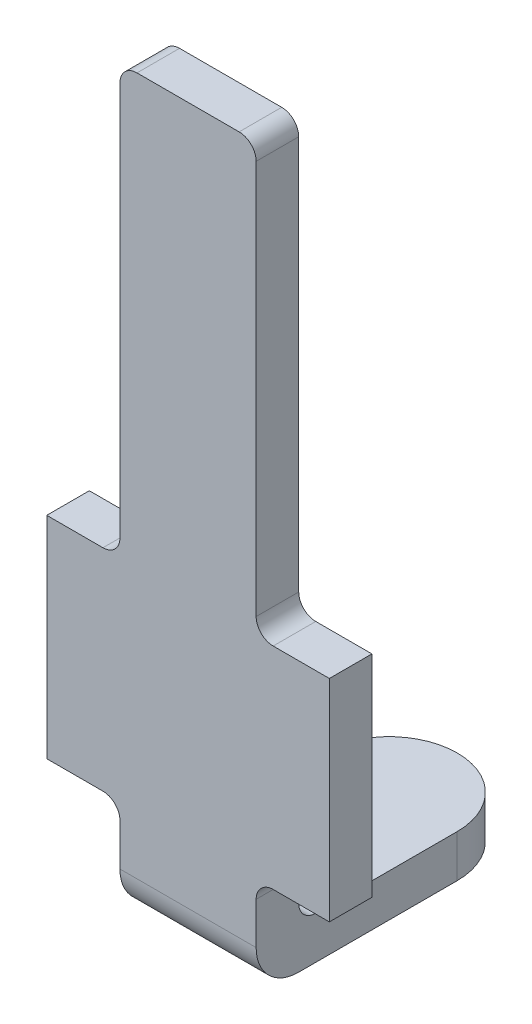
ISO-10303-21;
HEADER;
FILE_DESCRIPTION(('STEP AP214'),'2;1');
FILE_NAME('part.step','',(''),(''),'','','');
FILE_SCHEMA(('AUTOMOTIVE_DESIGN { 1 0 10303 214 1 1 1 1 }'));
ENDSEC;
DATA;
#1=APPLICATION_CONTEXT('core data for automotive mechanical design processes');
#2=APPLICATION_PROTOCOL_DEFINITION('international standard','automotive_design',2000,#1);
#3=PRODUCT_CONTEXT('',#1,'mechanical');
#4=PRODUCT('Part','Part','',(#3));
#5=PRODUCT_RELATED_PRODUCT_CATEGORY('part','',(#4));
#6=PRODUCT_DEFINITION_FORMATION('','',#4);
#7=PRODUCT_DEFINITION_CONTEXT('part definition',#1,'design');
#8=PRODUCT_DEFINITION('design','',#6,#7);
#9=PRODUCT_DEFINITION_SHAPE('','',#8);
#10=(LENGTH_UNIT() NAMED_UNIT(*) SI_UNIT(.MILLI.,.METRE.));
#11=(NAMED_UNIT(*) PLANE_ANGLE_UNIT() SI_UNIT($,.RADIAN.));
#12=(NAMED_UNIT(*) SI_UNIT($,.STERADIAN.) SOLID_ANGLE_UNIT());
#13=UNCERTAINTY_MEASURE_WITH_UNIT(LENGTH_MEASURE(1.E-05),#10,'distance_accuracy_value','');
#14=(GEOMETRIC_REPRESENTATION_CONTEXT(3) GLOBAL_UNCERTAINTY_ASSIGNED_CONTEXT((#13)) GLOBAL_UNIT_ASSIGNED_CONTEXT((#10,
#11,#12)) REPRESENTATION_CONTEXT('',''));
#15=CARTESIAN_POINT('',(0.,0.,0.));
#16=DIRECTION('',(0.,0.,1.));
#17=DIRECTION('',(1.,0.,0.));
#18=AXIS2_PLACEMENT_3D('',#15,#16,#17);
#19=CARTESIAN_POINT('',(-16.91,-0.45,-1.67999999999998));
#20=DIRECTION('',(-1.,0.,0.));
#21=DIRECTION('',(0.,0.,1.));
#22=AXIS2_PLACEMENT_3D('',#19,#20,#21);
#23=PLANE('',#22);
#24=DIRECTION('',(0.,0.,1.));
#25=VECTOR('',#24,1.);
#26=CARTESIAN_POINT('',(-16.91,-0.45,-1.67999999999998));
#27=LINE('',#26,#25);
#28=CARTESIAN_POINT('',(-16.91,-0.45,-1.67999999999998));
#29=VERTEX_POINT('',#28);
#30=CARTESIAN_POINT('',(-16.91,-0.45,-0.74899999999997));
#31=VERTEX_POINT('',#30);
#32=EDGE_CURVE('E278',#29,#31,#27,.T.);
#33=ORIENTED_EDGE('',*,*,#32,.T.);
#34=CARTESIAN_POINT('',(-16.91,-0.2,-0.74899999999997));
#35=DIRECTION('',(-1.,0.,0.));
#36=DIRECTION('',(0.,0.,1.));
#37=AXIS2_PLACEMENT_3D('',#34,#35,#36);
#38=CIRCLE('',#37,0.25);
#39=CARTESIAN_POINT('',(-16.91,-0.2,-0.49899999999997));
#40=VERTEX_POINT('',#39);
#41=EDGE_CURVE('E11',#31,#40,#38,.T.);
#42=ORIENTED_EDGE('',*,*,#41,.T.);
#43=DIRECTION('',(0.,1.,0.));
#44=VECTOR('',#43,1.);
#45=CARTESIAN_POINT('',(-16.91,-0.45,-0.49899999999997));
#46=LINE('',#45,#44);
#47=CARTESIAN_POINT('',(-16.91,0.0459658151929142,-0.49899999999997));
#48=VERTEX_POINT('',#47);
#49=EDGE_CURVE('E288',#40,#48,#46,.T.);
#50=ORIENTED_EDGE('',*,*,#49,.T.);
#51=DIRECTION('',(0.,0.,1.));
#52=VECTOR('',#51,1.);
#53=CARTESIAN_POINT('',(-16.91,0.0459658151929142,-1.67999999999998));
#54=LINE('',#53,#52);
#55=CARTESIAN_POINT('',(-16.91,0.0459658151929143,-0.748999999999971));
#56=VERTEX_POINT('',#55);
#57=EDGE_CURVE('E351',#48,#56,#54,.F.);
#58=ORIENTED_EDGE('',*,*,#57,.T.);
#59=DIRECTION('',(0.,-1.,0.));
#60=VECTOR('',#59,1.);
#61=CARTESIAN_POINT('',(-16.91,3.9,-0.748999999999972));
#62=LINE('',#61,#60);
#63=CARTESIAN_POINT('',(-16.91,-0.1,-0.748999999999971));
#64=VERTEX_POINT('',#63);
#65=EDGE_CURVE('E256',#56,#64,#62,.T.);
#66=ORIENTED_EDGE('',*,*,#65,.T.);
#67=CARTESIAN_POINT('',(-16.91,-0.1,-0.848999999999971));
#68=DIRECTION('',(-1.,0.,0.));
#69=DIRECTION('',(0.,0.,1.));
#70=AXIS2_PLACEMENT_3D('',#67,#68,#69);
#71=CIRCLE('',#70,0.1);
#72=CARTESIAN_POINT('',(-16.91,-0.2,-0.848999999999971));
#73=VERTEX_POINT('',#72);
#74=EDGE_CURVE('E368',#64,#73,#71,.F.);
#75=ORIENTED_EDGE('',*,*,#74,.T.);
#76=DIRECTION('',(0.,0.,-1.));
#77=VECTOR('',#76,1.);
#78=CARTESIAN_POINT('',(-16.91,-0.2,-0.748999999999971));
#79=LINE('',#78,#77);
#80=CARTESIAN_POINT('',(-16.91,-0.2,-1.68));
#81=VERTEX_POINT('',#80);
#82=EDGE_CURVE('E260',#73,#81,#79,.T.);
#83=ORIENTED_EDGE('',*,*,#82,.T.);
#84=DIRECTION('',(0.,1.,0.));
#85=VECTOR('',#84,1.);
#86=CARTESIAN_POINT('',(-16.91,-0.45,-1.67999999999998));
#87=LINE('',#86,#85);
#88=EDGE_CURVE('E291',#29,#81,#87,.T.);
#89=ORIENTED_EDGE('',*,*,#88,.F.);
#90=EDGE_LOOP('',(#33,#42,#50,#58,#66,#75,#83,#89));
#91=FACE_BOUND('',#90,.T.);
#92=ADVANCED_FACE('F42',(#91),#23,.T.);
#93=CARTESIAN_POINT('',(-16.11,-0.45,-0.498999999999972));
#94=DIRECTION('',(1.,0.,0.));
#95=DIRECTION('',(0.,0.,-1.));
#96=AXIS2_PLACEMENT_3D('',#93,#94,#95);
#97=PLANE('',#96);
#98=DIRECTION('',(0.,1.,0.));
#99=VECTOR('',#98,1.);
#100=CARTESIAN_POINT('',(-16.11,-0.45,-0.498999999999972));
#101=LINE('',#100,#99);
#102=CARTESIAN_POINT('',(-16.11,-0.2,-0.498999999999972));
#103=VERTEX_POINT('',#102);
#104=CARTESIAN_POINT('',(-16.11,0.0459658151929142,-0.498999999999972));
#105=VERTEX_POINT('',#104);
#106=EDGE_CURVE('E300',#103,#105,#101,.T.);
#107=ORIENTED_EDGE('',*,*,#106,.F.);
#108=CARTESIAN_POINT('',(-16.11,-0.2,-0.748999999999972));
#109=DIRECTION('',(1.,0.,0.));
#110=DIRECTION('',(0.,0.,-1.));
#111=AXIS2_PLACEMENT_3D('',#108,#109,#110);
#112=CIRCLE('',#111,0.25);
#113=CARTESIAN_POINT('',(-16.11,-0.45,-0.748999999999972));
#114=VERTEX_POINT('',#113);
#115=EDGE_CURVE('E65',#103,#114,#112,.T.);
#116=ORIENTED_EDGE('',*,*,#115,.T.);
#117=DIRECTION('',(0.,0.,-1.));
#118=VECTOR('',#117,1.);
#119=CARTESIAN_POINT('',(-16.11,-0.45,-0.498999999999972));
#120=LINE('',#119,#118);
#121=CARTESIAN_POINT('',(-16.11,-0.45,-1.68));
#122=VERTEX_POINT('',#121);
#123=EDGE_CURVE('E281',#114,#122,#120,.T.);
#124=ORIENTED_EDGE('',*,*,#123,.T.);
#125=DIRECTION('',(0.,1.,0.));
#126=VECTOR('',#125,1.);
#127=CARTESIAN_POINT('',(-16.11,-0.45,-1.68));
#128=LINE('',#127,#126);
#129=CARTESIAN_POINT('',(-16.11,-0.2,-1.68));
#130=VERTEX_POINT('',#129);
#131=EDGE_CURVE('E296',#122,#130,#128,.T.);
#132=ORIENTED_EDGE('',*,*,#131,.T.);
#133=DIRECTION('',(0.,0.,-1.));
#134=VECTOR('',#133,1.);
#135=CARTESIAN_POINT('',(-16.11,-0.2,-0.748999999999971));
#136=LINE('',#135,#134);
#137=CARTESIAN_POINT('',(-16.11,-0.2,-0.848999999999971));
#138=VERTEX_POINT('',#137);
#139=EDGE_CURVE('E261',#138,#130,#136,.T.);
#140=ORIENTED_EDGE('',*,*,#139,.F.);
#141=CARTESIAN_POINT('',(-16.11,-0.1,-0.848999999999971));
#142=DIRECTION('',(1.,0.,0.));
#143=DIRECTION('',(0.,0.,-1.));
#144=AXIS2_PLACEMENT_3D('',#141,#142,#143);
#145=CIRCLE('',#144,0.1);
#146=CARTESIAN_POINT('',(-16.11,-0.1,-0.748999999999971));
#147=VERTEX_POINT('',#146);
#148=EDGE_CURVE('E365',#138,#147,#145,.F.);
#149=ORIENTED_EDGE('',*,*,#148,.T.);
#150=DIRECTION('',(0.,-1.,0.));
#151=VECTOR('',#150,1.);
#152=CARTESIAN_POINT('',(-16.11,3.9,-0.748999999999972));
#153=LINE('',#152,#151);
#154=CARTESIAN_POINT('',(-16.11,0.0459658151929143,-0.748999999999971));
#155=VERTEX_POINT('',#154);
#156=EDGE_CURVE('E255',#155,#147,#153,.T.);
#157=ORIENTED_EDGE('',*,*,#156,.F.);
#158=DIRECTION('',(0.,0.,-1.));
#159=VECTOR('',#158,1.);
#160=CARTESIAN_POINT('',(-16.11,0.0459658151929142,-0.498999999999972));
#161=LINE('',#160,#159);
#162=EDGE_CURVE('E361',#155,#105,#161,.F.);
#163=ORIENTED_EDGE('',*,*,#162,.T.);
#164=EDGE_LOOP('',(#107,#116,#124,#132,#140,#149,#157,#163));
#165=FACE_BOUND('',#164,.T.);
#166=ADVANCED_FACE('F455',(#165),#97,.T.);
#167=CARTESIAN_POINT('',(-16.51,-0.45,-1.68));
#168=DIRECTION('',(0.,1.,0.));
#169=DIRECTION('',(0.,0.,1.));
#170=AXIS2_PLACEMENT_3D('',#167,#168,#169);
#171=CYLINDRICAL_SURFACE('',#170,0.400000000000001);
#172=CARTESIAN_POINT('',(-16.51,-0.2,-1.68));
#173=DIRECTION('',(0.,-1.,0.));
#174=DIRECTION('',(0.,0.,-1.));
#175=AXIS2_PLACEMENT_3D('',#172,#173,#174);
#176=CIRCLE('',#175,0.400000000000001);
#177=EDGE_CURVE('E273',#130,#81,#176,.F.);
#178=ORIENTED_EDGE('',*,*,#177,.F.);
#179=ORIENTED_EDGE('',*,*,#131,.F.);
#180=CARTESIAN_POINT('',(-16.51,-0.45,-1.68));
#181=DIRECTION('',(0.,1.,0.));
#182=DIRECTION('',(0.,0.,1.));
#183=AXIS2_PLACEMENT_3D('',#180,#181,#182);
#184=CIRCLE('',#183,0.400000000000001);
#185=EDGE_CURVE('E284',#122,#29,#184,.T.);
#186=ORIENTED_EDGE('',*,*,#185,.T.);
#187=ORIENTED_EDGE('',*,*,#88,.T.);
#188=EDGE_LOOP('',(#178,#179,#186,#187));
#189=FACE_BOUND('',#188,.T.);
#190=ADVANCED_FACE('F450',(#189),#171,.T.);
#191=CARTESIAN_POINT('',(-16.91,-0.45,-0.49899999999997));
#192=DIRECTION('',(0.,0.,1.));
#193=DIRECTION('',(1.,0.,0.));
#194=AXIS2_PLACEMENT_3D('',#191,#192,#193);
#195=PLANE('',#194);
#196=ORIENTED_EDGE('',*,*,#49,.F.);
#197=DIRECTION('',(1.,0.,0.));
#198=VECTOR('',#197,1.);
#199=CARTESIAN_POINT('',(-16.11,-0.2,-0.498999999999972));
#200=LINE('',#199,#198);
#201=EDGE_CURVE('E395',#40,#103,#200,.T.);
#202=ORIENTED_EDGE('',*,*,#201,.T.);
#203=ORIENTED_EDGE('',*,*,#106,.T.);
#204=CARTESIAN_POINT('',(-16.01,0.0459658151929142,-0.498999999999972));
#205=DIRECTION('',(0.,0.,1.));
#206=DIRECTION('',(1.,0.,0.));
#207=AXIS2_PLACEMENT_3D('',#204,#205,#206);
#208=CIRCLE('',#207,0.1);
#209=CARTESIAN_POINT('',(-16.01,0.145965815192914,-0.498999999999972));
#210=VERTEX_POINT('',#209);
#211=EDGE_CURVE('E392',#105,#210,#208,.F.);
#212=ORIENTED_EDGE('',*,*,#211,.T.);
#213=DIRECTION('',(-1.,0.,0.));
#214=VECTOR('',#213,1.);
#215=CARTESIAN_POINT('',(-15.68,0.145965815192914,-0.498999999999972));
#216=LINE('',#215,#214);
#217=CARTESIAN_POINT('',(-15.68,0.145965815192914,-0.498999999999972));
#218=VERTEX_POINT('',#217);
#219=EDGE_CURVE('E251',#218,#210,#216,.T.);
#220=ORIENTED_EDGE('',*,*,#219,.F.);
#221=DIRECTION('',(0.,-1.,0.));
#222=VECTOR('',#221,1.);
#223=CARTESIAN_POINT('',(-15.68,0.145965815192914,-0.498999999999972));
#224=LINE('',#223,#222);
#225=CARTESIAN_POINT('',(-15.68,1.38437551370885,-0.498999999999972));
#226=VERTEX_POINT('',#225);
#227=EDGE_CURVE('E237',#226,#218,#224,.T.);
#228=ORIENTED_EDGE('',*,*,#227,.F.);
#229=DIRECTION('',(-1.,0.,0.));
#230=VECTOR('',#229,1.);
#231=CARTESIAN_POINT('',(-15.68,1.38437551370885,-0.498999999999968));
#232=LINE('',#231,#230);
#233=CARTESIAN_POINT('',(-16.01,1.38437551370885,-0.498999999999968));
#234=VERTEX_POINT('',#233);
#235=EDGE_CURVE('E407',#226,#234,#232,.T.);
#236=ORIENTED_EDGE('',*,*,#235,.T.);
#237=CARTESIAN_POINT('',(-16.01,1.48437551370885,-0.498999999999972));
#238=DIRECTION('',(0.,0.,1.));
#239=DIRECTION('',(1.,0.,0.));
#240=AXIS2_PLACEMENT_3D('',#237,#238,#239);
#241=CIRCLE('',#240,0.1);
#242=CARTESIAN_POINT('',(-16.11,1.48437551370885,-0.498999999999968));
#243=VERTEX_POINT('',#242);
#244=EDGE_CURVE('E374',#234,#243,#241,.F.);
#245=ORIENTED_EDGE('',*,*,#244,.T.);
#246=DIRECTION('',(0.,1.,0.));
#247=VECTOR('',#246,1.);
#248=CARTESIAN_POINT('',(-16.11,1.38437551370885,-0.498999999999968));
#249=LINE('',#248,#247);
#250=CARTESIAN_POINT('',(-16.11,3.8,-0.498999999999969));
#251=VERTEX_POINT('',#250);
#252=EDGE_CURVE('E414',#243,#251,#249,.T.);
#253=ORIENTED_EDGE('',*,*,#252,.T.);
#254=CARTESIAN_POINT('',(-16.21,3.8,-0.498999999999971));
#255=DIRECTION('',(0.,0.,1.));
#256=DIRECTION('',(1.,0.,0.));
#257=AXIS2_PLACEMENT_3D('',#254,#255,#256);
#258=CIRCLE('',#257,0.1);
#259=CARTESIAN_POINT('',(-16.21,3.9,-0.498999999999971));
#260=VERTEX_POINT('',#259);
#261=EDGE_CURVE('E327',#251,#260,#258,.T.);
#262=ORIENTED_EDGE('',*,*,#261,.T.);
#263=DIRECTION('',(1.,0.,0.));
#264=VECTOR('',#263,1.);
#265=CARTESIAN_POINT('',(-16.91,3.9,-0.49899999999997));
#266=LINE('',#265,#264);
#267=CARTESIAN_POINT('',(-16.81,3.9,-0.49899999999997));
#268=VERTEX_POINT('',#267);
#269=EDGE_CURVE('E277',#268,#260,#266,.T.);
#270=ORIENTED_EDGE('',*,*,#269,.F.);
#271=CARTESIAN_POINT('',(-16.81,3.8,-0.49899999999997));
#272=DIRECTION('',(0.,0.,1.));
#273=DIRECTION('',(1.,0.,0.));
#274=AXIS2_PLACEMENT_3D('',#271,#272,#273);
#275=CIRCLE('',#274,0.1);
#276=CARTESIAN_POINT('',(-16.91,3.8,-0.498999999999968));
#277=VERTEX_POINT('',#276);
#278=EDGE_CURVE('E330',#268,#277,#275,.T.);
#279=ORIENTED_EDGE('',*,*,#278,.T.);
#280=DIRECTION('',(0.,-1.,0.));
#281=VECTOR('',#280,1.);
#282=CARTESIAN_POINT('',(-16.91,3.9,-0.498999999999968));
#283=LINE('',#282,#281);
#284=CARTESIAN_POINT('',(-16.91,1.48437551370885,-0.498999999999967));
#285=VERTEX_POINT('',#284);
#286=EDGE_CURVE('E206',#277,#285,#283,.T.);
#287=ORIENTED_EDGE('',*,*,#286,.T.);
#288=CARTESIAN_POINT('',(-17.01,1.48437551370885,-0.49899999999997));
#289=DIRECTION('',(0.,0.,1.));
#290=DIRECTION('',(1.,0.,0.));
#291=AXIS2_PLACEMENT_3D('',#288,#289,#290);
#292=CIRCLE('',#291,0.1);
#293=CARTESIAN_POINT('',(-17.01,1.38437551370885,-0.498999999999967));
#294=VERTEX_POINT('',#293);
#295=EDGE_CURVE('E200',#285,#294,#292,.F.);
#296=ORIENTED_EDGE('',*,*,#295,.T.);
#297=DIRECTION('',(-1.,0.,0.));
#298=VECTOR('',#297,1.);
#299=CARTESIAN_POINT('',(-16.91,1.38437551370885,-0.498999999999967));
#300=LINE('',#299,#298);
#301=CARTESIAN_POINT('',(-17.34,1.38437551370885,-0.498999999999967));
#302=VERTEX_POINT('',#301);
#303=EDGE_CURVE('E191',#294,#302,#300,.T.);
#304=ORIENTED_EDGE('',*,*,#303,.T.);
#305=DIRECTION('',(0.,1.,0.));
#306=VECTOR('',#305,1.);
#307=CARTESIAN_POINT('',(-17.34,3.9,-0.498999999999969));
#308=LINE('',#307,#306);
#309=CARTESIAN_POINT('',(-17.34,0.145965815192914,-0.498999999999969));
#310=VERTEX_POINT('',#309);
#311=EDGE_CURVE('E197',#310,#302,#308,.T.);
#312=ORIENTED_EDGE('',*,*,#311,.F.);
#313=DIRECTION('',(1.,0.,0.));
#314=VECTOR('',#313,1.);
#315=CARTESIAN_POINT('',(-17.34,0.145965815192914,-0.498999999999969));
#316=LINE('',#315,#314);
#317=CARTESIAN_POINT('',(-17.01,0.145965815192914,-0.498999999999969));
#318=VERTEX_POINT('',#317);
#319=EDGE_CURVE('E222',#310,#318,#316,.T.);
#320=ORIENTED_EDGE('',*,*,#319,.T.);
#321=CARTESIAN_POINT('',(-17.01,0.0459658151929142,-0.49899999999997));
#322=DIRECTION('',(0.,0.,1.));
#323=DIRECTION('',(1.,0.,0.));
#324=AXIS2_PLACEMENT_3D('',#321,#322,#323);
#325=CIRCLE('',#324,0.1);
#326=EDGE_CURVE('E377',#318,#48,#325,.F.);
#327=ORIENTED_EDGE('',*,*,#326,.T.);
#328=EDGE_LOOP('',(#196,#202,#203,#212,#220,#228,#236,#245,#253,#262,#270,#279,#287,#296,#304,
#312,#320,#327));
#329=FACE_BOUND('',#328,.T.);
#330=ADVANCED_FACE('F194',(#329),#195,.T.);
#331=CARTESIAN_POINT('',(-16.51,-0.45,-1.68));
#332=DIRECTION('',(0.,1.,0.));
#333=DIRECTION('',(0.,0.,1.));
#334=AXIS2_PLACEMENT_3D('',#331,#332,#333);
#335=PLANE('',#334);
#336=ORIENTED_EDGE('',*,*,#123,.F.);
#337=DIRECTION('',(1.,0.,0.));
#338=VECTOR('',#337,1.);
#339=CARTESIAN_POINT('',(-16.91,-0.45,-0.74899999999997));
#340=LINE('',#339,#338);
#341=EDGE_CURVE('E51',#114,#31,#340,.F.);
#342=ORIENTED_EDGE('',*,*,#341,.T.);
#343=ORIENTED_EDGE('',*,*,#32,.F.);
#344=ORIENTED_EDGE('',*,*,#185,.F.);
#345=EDGE_LOOP('',(#336,#342,#343,#344));
#346=FACE_BOUND('',#345,.T.);
#347=ADVANCED_FACE('F453',(#346),#335,.F.);
#348=CARTESIAN_POINT('',(-16.51,3.9,-1.68));
#349=DIRECTION('',(0.,1.,0.));
#350=DIRECTION('',(0.,0.,1.));
#351=AXIS2_PLACEMENT_3D('',#348,#349,#350);
#352=PLANE('',#351);
#353=DIRECTION('',(1.,0.,0.));
#354=VECTOR('',#353,1.);
#355=CARTESIAN_POINT('',(-16.91,3.9,-0.748999999999972));
#356=LINE('',#355,#354);
#357=CARTESIAN_POINT('',(-16.81,3.9,-0.748999999999972));
#358=VERTEX_POINT('',#357);
#359=CARTESIAN_POINT('',(-16.21,3.9,-0.748999999999972));
#360=VERTEX_POINT('',#359);
#361=EDGE_CURVE('E264',#358,#360,#356,.T.);
#362=ORIENTED_EDGE('',*,*,#361,.F.);
#363=DIRECTION('',(0.,0.,-1.));
#364=VECTOR('',#363,1.);
#365=CARTESIAN_POINT('',(-16.81,3.9,-0.498999999999968));
#366=LINE('',#365,#364);
#367=EDGE_CURVE('E324',#358,#268,#366,.F.);
#368=ORIENTED_EDGE('',*,*,#367,.T.);
#369=ORIENTED_EDGE('',*,*,#269,.T.);
#370=DIRECTION('',(0.,0.,-1.));
#371=VECTOR('',#370,1.);
#372=CARTESIAN_POINT('',(-16.21,3.9,-0.748999999999972));
#373=LINE('',#372,#371);
#374=EDGE_CURVE('E320',#260,#360,#373,.T.);
#375=ORIENTED_EDGE('',*,*,#374,.T.);
#376=EDGE_LOOP('',(#362,#368,#369,#375));
#377=FACE_BOUND('',#376,.T.);
#378=ADVANCED_FACE('F487',(#377),#352,.T.);
#379=CARTESIAN_POINT('',(-16.91,-0.2,-0.748999999999971));
#380=DIRECTION('',(0.,-1.,0.));
#381=DIRECTION('',(0.,0.,-1.));
#382=AXIS2_PLACEMENT_3D('',#379,#380,#381);
#383=PLANE('',#382);
#384=ORIENTED_EDGE('',*,*,#82,.F.);
#385=DIRECTION('',(1.,0.,0.));
#386=VECTOR('',#385,1.);
#387=CARTESIAN_POINT('',(-16.11,-0.2,-0.848999999999971));
#388=LINE('',#387,#386);
#389=EDGE_CURVE('E333',#73,#138,#388,.T.);
#390=ORIENTED_EDGE('',*,*,#389,.T.);
#391=ORIENTED_EDGE('',*,*,#139,.T.);
#392=ORIENTED_EDGE('',*,*,#177,.T.);
#393=EDGE_LOOP('',(#384,#390,#391,#392));
#394=FACE_BOUND('',#393,.T.);
#395=ADVANCED_FACE('F445',(#394),#383,.F.);
#396=CARTESIAN_POINT('',(-16.91,3.9,-0.748999999999972));
#397=DIRECTION('',(0.,0.,1.));
#398=DIRECTION('',(0.,-1.,0.));
#399=AXIS2_PLACEMENT_3D('',#396,#397,#398);
#400=PLANE('',#399);
#401=DIRECTION('',(0.,-1.,0.));
#402=VECTOR('',#401,1.);
#403=CARTESIAN_POINT('',(-16.91,3.9,-0.748999999999972));
#404=LINE('',#403,#402);
#405=CARTESIAN_POINT('',(-16.91,3.8,-0.748999999999972));
#406=VERTEX_POINT('',#405);
#407=CARTESIAN_POINT('',(-16.91,1.48437551370885,-0.748999999999971));
#408=VERTEX_POINT('',#407);
#409=EDGE_CURVE('E403',#406,#408,#404,.T.);
#410=ORIENTED_EDGE('',*,*,#409,.F.);
#411=CARTESIAN_POINT('',(-16.81,3.8,-0.748999999999972));
#412=DIRECTION('',(0.,0.,1.));
#413=DIRECTION('',(0.,-1.,0.));
#414=AXIS2_PLACEMENT_3D('',#411,#412,#413);
#415=CIRCLE('',#414,0.1);
#416=EDGE_CURVE('E317',#406,#358,#415,.F.);
#417=ORIENTED_EDGE('',*,*,#416,.T.);
#418=ORIENTED_EDGE('',*,*,#361,.T.);
#419=CARTESIAN_POINT('',(-16.21,3.8,-0.748999999999972));
#420=DIRECTION('',(0.,0.,1.));
#421=DIRECTION('',(0.,-1.,0.));
#422=AXIS2_PLACEMENT_3D('',#419,#420,#421);
#423=CIRCLE('',#422,0.1);
#424=CARTESIAN_POINT('',(-16.11,3.8,-0.748999999999972));
#425=VERTEX_POINT('',#424);
#426=EDGE_CURVE('E311',#360,#425,#423,.F.);
#427=ORIENTED_EDGE('',*,*,#426,.T.);
#428=DIRECTION('',(0.,1.,0.));
#429=VECTOR('',#428,1.);
#430=CARTESIAN_POINT('',(-16.11,1.38437551370885,-0.748999999999971));
#431=LINE('',#430,#429);
#432=CARTESIAN_POINT('',(-16.11,1.48437551370885,-0.748999999999971));
#433=VERTEX_POINT('',#432);
#434=EDGE_CURVE('E405',#433,#425,#431,.T.);
#435=ORIENTED_EDGE('',*,*,#434,.F.);
#436=CARTESIAN_POINT('',(-16.01,1.48437551370885,-0.748999999999971));
#437=DIRECTION('',(0.,0.,1.));
#438=DIRECTION('',(0.,-1.,0.));
#439=AXIS2_PLACEMENT_3D('',#436,#437,#438);
#440=CIRCLE('',#439,0.1);
#441=CARTESIAN_POINT('',(-16.01,1.38437551370885,-0.748999999999971));
#442=VERTEX_POINT('',#441);
#443=EDGE_CURVE('E371',#433,#442,#440,.T.);
#444=ORIENTED_EDGE('',*,*,#443,.T.);
#445=DIRECTION('',(-1.,0.,0.));
#446=VECTOR('',#445,1.);
#447=CARTESIAN_POINT('',(-15.68,1.38437551370885,-0.748999999999971));
#448=LINE('',#447,#446);
#449=CARTESIAN_POINT('',(-15.68,1.38437551370885,-0.748999999999971));
#450=VERTEX_POINT('',#449);
#451=EDGE_CURVE('E215',#450,#442,#448,.T.);
#452=ORIENTED_EDGE('',*,*,#451,.F.);
#453=DIRECTION('',(0.,1.,0.));
#454=VECTOR('',#453,1.);
#455=CARTESIAN_POINT('',(-15.68,3.9,-0.748999999999972));
#456=LINE('',#455,#454);
#457=CARTESIAN_POINT('',(-15.68,0.145965815192914,-0.748999999999972));
#458=VERTEX_POINT('',#457);
#459=EDGE_CURVE('E243',#458,#450,#456,.T.);
#460=ORIENTED_EDGE('',*,*,#459,.F.);
#461=DIRECTION('',(-1.,0.,0.));
#462=VECTOR('',#461,1.);
#463=CARTESIAN_POINT('',(-15.68,0.145965815192914,-0.748999999999972));
#464=LINE('',#463,#462);
#465=CARTESIAN_POINT('',(-16.01,0.145965815192914,-0.748999999999972));
#466=VERTEX_POINT('',#465);
#467=EDGE_CURVE('E247',#458,#466,#464,.T.);
#468=ORIENTED_EDGE('',*,*,#467,.T.);
#469=CARTESIAN_POINT('',(-16.01,0.0459658151929142,-0.748999999999971));
#470=DIRECTION('',(0.,0.,1.));
#471=DIRECTION('',(0.,-1.,0.));
#472=AXIS2_PLACEMENT_3D('',#469,#470,#471);
#473=CIRCLE('',#472,0.1);
#474=EDGE_CURVE('E389',#466,#155,#473,.T.);
#475=ORIENTED_EDGE('',*,*,#474,.T.);
#476=ORIENTED_EDGE('',*,*,#156,.T.);
#477=DIRECTION('',(1.,0.,0.));
#478=VECTOR('',#477,1.);
#479=CARTESIAN_POINT('',(-16.91,-0.1,-0.748999999999971));
#480=LINE('',#479,#478);
#481=EDGE_CURVE('E314',#147,#64,#480,.F.);
#482=ORIENTED_EDGE('',*,*,#481,.T.);
#483=ORIENTED_EDGE('',*,*,#65,.F.);
#484=CARTESIAN_POINT('',(-17.01,0.0459658151929142,-0.748999999999971));
#485=DIRECTION('',(0.,0.,1.));
#486=DIRECTION('',(0.,-1.,0.));
#487=AXIS2_PLACEMENT_3D('',#484,#485,#486);
#488=CIRCLE('',#487,0.1);
#489=CARTESIAN_POINT('',(-17.01,0.145965815192914,-0.748999999999969));
#490=VERTEX_POINT('',#489);
#491=EDGE_CURVE('E381',#56,#490,#488,.T.);
#492=ORIENTED_EDGE('',*,*,#491,.T.);
#493=DIRECTION('',(1.,0.,0.));
#494=VECTOR('',#493,1.);
#495=CARTESIAN_POINT('',(-17.34,0.145965815192914,-0.748999999999969));
#496=LINE('',#495,#494);
#497=CARTESIAN_POINT('',(-17.34,0.145965815192914,-0.748999999999969));
#498=VERTEX_POINT('',#497);
#499=EDGE_CURVE('E227',#498,#490,#496,.T.);
#500=ORIENTED_EDGE('',*,*,#499,.F.);
#501=DIRECTION('',(0.,-1.,0.));
#502=VECTOR('',#501,1.);
#503=CARTESIAN_POINT('',(-17.34,0.145965815192914,-0.748999999999969));
#504=LINE('',#503,#502);
#505=CARTESIAN_POINT('',(-17.34,1.38437551370885,-0.748999999999969));
#506=VERTEX_POINT('',#505);
#507=EDGE_CURVE('E230',#506,#498,#504,.T.);
#508=ORIENTED_EDGE('',*,*,#507,.F.);
#509=DIRECTION('',(-1.,0.,0.));
#510=VECTOR('',#509,1.);
#511=CARTESIAN_POINT('',(-16.91,1.38437551370885,-0.748999999999971));
#512=LINE('',#511,#510);
#513=CARTESIAN_POINT('',(-17.01,1.38437551370885,-0.748999999999971));
#514=VERTEX_POINT('',#513);
#515=EDGE_CURVE('E211',#514,#506,#512,.T.);
#516=ORIENTED_EDGE('',*,*,#515,.F.);
#517=CARTESIAN_POINT('',(-17.01,1.48437551370885,-0.748999999999971));
#518=DIRECTION('',(0.,0.,1.));
#519=DIRECTION('',(0.,-1.,0.));
#520=AXIS2_PLACEMENT_3D('',#517,#518,#519);
#521=CIRCLE('',#520,0.1);
#522=EDGE_CURVE('E384',#514,#408,#521,.T.);
#523=ORIENTED_EDGE('',*,*,#522,.T.);
#524=EDGE_LOOP('',(#410,#417,#418,#427,#435,#444,#452,#460,#468,#475,#476,#482,#483,#492,#500,
#508,#516,#523));
#525=FACE_BOUND('',#524,.T.);
#526=ADVANCED_FACE('F426',(#525),#400,.F.);
#527=CARTESIAN_POINT('',(-15.68,0.145965815192914,-0.748999999999972));
#528=DIRECTION('',(0.,1.,0.));
#529=DIRECTION('',(0.,0.,1.));
#530=AXIS2_PLACEMENT_3D('',#527,#528,#529);
#531=PLANE('',#530);
#532=ORIENTED_EDGE('',*,*,#219,.T.);
#533=DIRECTION('',(0.,0.,-1.));
#534=VECTOR('',#533,1.);
#535=CARTESIAN_POINT('',(-16.01,0.145965815192914,-0.748999999999972));
#536=LINE('',#535,#534);
#537=EDGE_CURVE('E357',#210,#466,#536,.T.);
#538=ORIENTED_EDGE('',*,*,#537,.T.);
#539=ORIENTED_EDGE('',*,*,#467,.F.);
#540=DIRECTION('',(0.,0.,-1.));
#541=VECTOR('',#540,1.);
#542=CARTESIAN_POINT('',(-15.68,0.145965815192914,-0.748999999999972));
#543=LINE('',#542,#541);
#544=EDGE_CURVE('E240',#218,#458,#543,.T.);
#545=ORIENTED_EDGE('',*,*,#544,.F.);
#546=EDGE_LOOP('',(#532,#538,#539,#545));
#547=FACE_BOUND('',#546,.T.);
#548=ADVANCED_FACE('F465',(#547),#531,.F.);
#549=CARTESIAN_POINT('',(-15.68,0.,0.));
#550=DIRECTION('',(-1.,0.,0.));
#551=DIRECTION('',(0.,0.,1.));
#552=AXIS2_PLACEMENT_3D('',#549,#550,#551);
#553=PLANE('',#552);
#554=ORIENTED_EDGE('',*,*,#459,.T.);
#555=DIRECTION('',(0.,0.,-1.));
#556=VECTOR('',#555,1.);
#557=CARTESIAN_POINT('',(-15.68,1.38437551370885,-0.498999999999968));
#558=LINE('',#557,#556);
#559=EDGE_CURVE('E421',#226,#450,#558,.T.);
#560=ORIENTED_EDGE('',*,*,#559,.F.);
#561=ORIENTED_EDGE('',*,*,#227,.T.);
#562=ORIENTED_EDGE('',*,*,#544,.T.);
#563=EDGE_LOOP('',(#554,#560,#561,#562));
#564=FACE_BOUND('',#563,.T.);
#565=ADVANCED_FACE('F469',(#564),#553,.F.);
#566=CARTESIAN_POINT('',(-17.34,0.145965815192914,-0.498999999999969));
#567=DIRECTION('',(0.,1.,0.));
#568=DIRECTION('',(0.,0.,1.));
#569=AXIS2_PLACEMENT_3D('',#566,#567,#568);
#570=PLANE('',#569);
#571=ORIENTED_EDGE('',*,*,#499,.T.);
#572=DIRECTION('',(0.,0.,1.));
#573=VECTOR('',#572,1.);
#574=CARTESIAN_POINT('',(-17.01,0.145965815192914,-0.498999999999969));
#575=LINE('',#574,#573);
#576=EDGE_CURVE('E347',#490,#318,#575,.T.);
#577=ORIENTED_EDGE('',*,*,#576,.T.);
#578=ORIENTED_EDGE('',*,*,#319,.F.);
#579=DIRECTION('',(0.,0.,1.));
#580=VECTOR('',#579,1.);
#581=CARTESIAN_POINT('',(-17.34,0.145965815192914,-0.498999999999969));
#582=LINE('',#581,#580);
#583=EDGE_CURVE('E219',#498,#310,#582,.T.);
#584=ORIENTED_EDGE('',*,*,#583,.F.);
#585=EDGE_LOOP('',(#571,#577,#578,#584));
#586=FACE_BOUND('',#585,.T.);
#587=ADVANCED_FACE('F431',(#586),#570,.F.);
#588=CARTESIAN_POINT('',(-17.34,0.,0.));
#589=DIRECTION('',(1.,0.,0.));
#590=DIRECTION('',(0.,0.,-1.));
#591=AXIS2_PLACEMENT_3D('',#588,#589,#590);
#592=PLANE('',#591);
#593=ORIENTED_EDGE('',*,*,#311,.T.);
#594=DIRECTION('',(0.,0.,-1.));
#595=VECTOR('',#594,1.);
#596=CARTESIAN_POINT('',(-17.34,1.38437551370885,-0.498999999999967));
#597=LINE('',#596,#595);
#598=EDGE_CURVE('E205',#302,#506,#597,.T.);
#599=ORIENTED_EDGE('',*,*,#598,.T.);
#600=ORIENTED_EDGE('',*,*,#507,.T.);
#601=ORIENTED_EDGE('',*,*,#583,.T.);
#602=EDGE_LOOP('',(#593,#599,#600,#601));
#603=FACE_BOUND('',#602,.T.);
#604=ADVANCED_FACE('F217',(#603),#592,.F.);
#605=CARTESIAN_POINT('',(-16.11,1.38437551370885,-0.498999999999968));
#606=DIRECTION('',(-1.,0.,0.));
#607=DIRECTION('',(0.,0.,1.));
#608=AXIS2_PLACEMENT_3D('',#605,#606,#607);
#609=PLANE('',#608);
#610=ORIENTED_EDGE('',*,*,#252,.F.);
#611=DIRECTION('',(0.,0.,-1.));
#612=VECTOR('',#611,1.);
#613=CARTESIAN_POINT('',(-16.11,1.48437551370885,-0.748999999999971));
#614=LINE('',#613,#612);
#615=EDGE_CURVE('E340',#243,#433,#614,.T.);
#616=ORIENTED_EDGE('',*,*,#615,.T.);
#617=ORIENTED_EDGE('',*,*,#434,.T.);
#618=DIRECTION('',(0.,0.,-1.));
#619=VECTOR('',#618,1.);
#620=CARTESIAN_POINT('',(-16.11,3.8,-0.498999999999969));
#621=LINE('',#620,#619);
#622=EDGE_CURVE('E337',#425,#251,#621,.F.);
#623=ORIENTED_EDGE('',*,*,#622,.T.);
#624=EDGE_LOOP('',(#610,#616,#617,#623));
#625=FACE_BOUND('',#624,.T.);
#626=ADVANCED_FACE('F479',(#625),#609,.F.);
#627=CARTESIAN_POINT('',(-15.68,1.38437551370885,-0.498999999999968));
#628=DIRECTION('',(0.,-1.,0.));
#629=DIRECTION('',(0.,0.,-1.));
#630=AXIS2_PLACEMENT_3D('',#627,#628,#629);
#631=PLANE('',#630);
#632=ORIENTED_EDGE('',*,*,#451,.T.);
#633=DIRECTION('',(0.,0.,-1.));
#634=VECTOR('',#633,1.);
#635=CARTESIAN_POINT('',(-16.01,1.38437551370885,-0.498999999999968));
#636=LINE('',#635,#634);
#637=EDGE_CURVE('E344',#442,#234,#636,.F.);
#638=ORIENTED_EDGE('',*,*,#637,.T.);
#639=ORIENTED_EDGE('',*,*,#235,.F.);
#640=ORIENTED_EDGE('',*,*,#559,.T.);
#641=EDGE_LOOP('',(#632,#638,#639,#640));
#642=FACE_BOUND('',#641,.T.);
#643=ADVANCED_FACE('F665',(#642),#631,.F.);
#644=CARTESIAN_POINT('',(-16.91,3.9,-0.498999999999968));
#645=DIRECTION('',(1.,0.,0.));
#646=DIRECTION('',(0.,0.,-1.));
#647=AXIS2_PLACEMENT_3D('',#644,#645,#646);
#648=PLANE('',#647);
#649=ORIENTED_EDGE('',*,*,#286,.F.);
#650=DIRECTION('',(0.,0.,-1.));
#651=VECTOR('',#650,1.);
#652=CARTESIAN_POINT('',(-16.91,3.8,-0.748999999999972));
#653=LINE('',#652,#651);
#654=EDGE_CURVE('E307',#277,#406,#653,.T.);
#655=ORIENTED_EDGE('',*,*,#654,.T.);
#656=ORIENTED_EDGE('',*,*,#409,.T.);
#657=DIRECTION('',(0.,0.,-1.));
#658=VECTOR('',#657,1.);
#659=CARTESIAN_POINT('',(-16.91,1.48437551370885,-0.498999999999967));
#660=LINE('',#659,#658);
#661=EDGE_CURVE('E295',#408,#285,#660,.F.);
#662=ORIENTED_EDGE('',*,*,#661,.T.);
#663=EDGE_LOOP('',(#649,#655,#656,#662));
#664=FACE_BOUND('',#663,.T.);
#665=ADVANCED_FACE('F497',(#664),#648,.F.);
#666=CARTESIAN_POINT('',(-16.91,1.38437551370885,-0.498999999999967));
#667=DIRECTION('',(0.,-1.,0.));
#668=DIRECTION('',(0.,0.,-1.));
#669=AXIS2_PLACEMENT_3D('',#666,#667,#668);
#670=PLANE('',#669);
#671=ORIENTED_EDGE('',*,*,#303,.F.);
#672=DIRECTION('',(0.,0.,-1.));
#673=VECTOR('',#672,1.);
#674=CARTESIAN_POINT('',(-17.01,1.38437551370885,-0.748999999999971));
#675=LINE('',#674,#673);
#676=EDGE_CURVE('E354',#294,#514,#675,.T.);
#677=ORIENTED_EDGE('',*,*,#676,.T.);
#678=ORIENTED_EDGE('',*,*,#515,.T.);
#679=ORIENTED_EDGE('',*,*,#598,.F.);
#680=EDGE_LOOP('',(#671,#677,#678,#679));
#681=FACE_BOUND('',#680,.T.);
#682=ADVANCED_FACE('F209',(#681),#670,.F.);
#683=CARTESIAN_POINT('',(-16.81,3.8,-0.498999999999968));
#684=DIRECTION('',(0.,0.,1.));
#685=DIRECTION('',(1.,0.,0.));
#686=AXIS2_PLACEMENT_3D('',#683,#684,#685);
#687=CYLINDRICAL_SURFACE('',#686,0.1);
#688=ORIENTED_EDGE('',*,*,#278,.F.);
#689=ORIENTED_EDGE('',*,*,#367,.F.);
#690=ORIENTED_EDGE('',*,*,#416,.F.);
#691=ORIENTED_EDGE('',*,*,#654,.F.);
#692=EDGE_LOOP('',(#688,#689,#690,#691));
#693=FACE_BOUND('',#692,.T.);
#694=ADVANCED_FACE('F494',(#693),#687,.T.);
#695=CARTESIAN_POINT('',(-16.91,-0.1,-0.848999999999971));
#696=DIRECTION('',(-1.,0.,0.));
#697=DIRECTION('',(0.,0.,1.));
#698=AXIS2_PLACEMENT_3D('',#695,#696,#697);
#699=CYLINDRICAL_SURFACE('',#698,0.1);
#700=ORIENTED_EDGE('',*,*,#74,.F.);
#701=ORIENTED_EDGE('',*,*,#481,.F.);
#702=ORIENTED_EDGE('',*,*,#148,.F.);
#703=ORIENTED_EDGE('',*,*,#389,.F.);
#704=EDGE_LOOP('',(#700,#701,#702,#703));
#705=FACE_BOUND('',#704,.T.);
#706=ADVANCED_FACE('F441',(#705),#699,.F.);
#707=CARTESIAN_POINT('',(-16.01,1.48437551370885,-0.498999999999968));
#708=DIRECTION('',(0.,0.,1.));
#709=DIRECTION('',(0.,-1.,0.));
#710=AXIS2_PLACEMENT_3D('',#707,#708,#709);
#711=CYLINDRICAL_SURFACE('',#710,0.1);
#712=ORIENTED_EDGE('',*,*,#244,.F.);
#713=ORIENTED_EDGE('',*,*,#637,.F.);
#714=ORIENTED_EDGE('',*,*,#443,.F.);
#715=ORIENTED_EDGE('',*,*,#615,.F.);
#716=EDGE_LOOP('',(#712,#713,#714,#715));
#717=FACE_BOUND('',#716,.T.);
#718=ADVANCED_FACE('F478',(#717),#711,.F.);
#719=CARTESIAN_POINT('',(-16.21,3.8,-1.68));
#720=DIRECTION('',(0.,0.,1.));
#721=DIRECTION('',(1.,0.,0.));
#722=AXIS2_PLACEMENT_3D('',#719,#720,#721);
#723=CYLINDRICAL_SURFACE('',#722,0.1);
#724=ORIENTED_EDGE('',*,*,#261,.F.);
#725=ORIENTED_EDGE('',*,*,#622,.F.);
#726=ORIENTED_EDGE('',*,*,#426,.F.);
#727=ORIENTED_EDGE('',*,*,#374,.F.);
#728=EDGE_LOOP('',(#724,#725,#726,#727));
#729=FACE_BOUND('',#728,.T.);
#730=ADVANCED_FACE('F485',(#729),#723,.T.);
#731=CARTESIAN_POINT('',(-17.01,0.0459658151929142,-0.498999999999969));
#732=DIRECTION('',(0.,0.,1.));
#733=DIRECTION('',(1.,0.,0.));
#734=AXIS2_PLACEMENT_3D('',#731,#732,#733);
#735=CYLINDRICAL_SURFACE('',#734,0.1);
#736=ORIENTED_EDGE('',*,*,#491,.F.);
#737=ORIENTED_EDGE('',*,*,#57,.F.);
#738=ORIENTED_EDGE('',*,*,#326,.F.);
#739=ORIENTED_EDGE('',*,*,#576,.F.);
#740=EDGE_LOOP('',(#736,#737,#738,#739));
#741=FACE_BOUND('',#740,.T.);
#742=ADVANCED_FACE('F435',(#741),#735,.F.);
#743=CARTESIAN_POINT('',(-17.01,1.48437551370885,-0.498999999999967));
#744=DIRECTION('',(0.,0.,1.));
#745=DIRECTION('',(0.,-1.,0.));
#746=AXIS2_PLACEMENT_3D('',#743,#744,#745);
#747=CYLINDRICAL_SURFACE('',#746,0.1);
#748=ORIENTED_EDGE('',*,*,#295,.F.);
#749=ORIENTED_EDGE('',*,*,#661,.F.);
#750=ORIENTED_EDGE('',*,*,#522,.F.);
#751=ORIENTED_EDGE('',*,*,#676,.F.);
#752=EDGE_LOOP('',(#748,#749,#750,#751));
#753=FACE_BOUND('',#752,.T.);
#754=ADVANCED_FACE('F505',(#753),#747,.F.);
#755=CARTESIAN_POINT('',(-16.01,0.0459658151929142,-0.748999999999972));
#756=DIRECTION('',(0.,0.,-1.));
#757=DIRECTION('',(-1.,0.,0.));
#758=AXIS2_PLACEMENT_3D('',#755,#756,#757);
#759=CYLINDRICAL_SURFACE('',#758,0.1);
#760=ORIENTED_EDGE('',*,*,#211,.F.);
#761=ORIENTED_EDGE('',*,*,#162,.F.);
#762=ORIENTED_EDGE('',*,*,#474,.F.);
#763=ORIENTED_EDGE('',*,*,#537,.F.);
#764=EDGE_LOOP('',(#760,#761,#762,#763));
#765=FACE_BOUND('',#764,.T.);
#766=ADVANCED_FACE('F460',(#765),#759,.F.);
#767=CARTESIAN_POINT('',(-16.91,-0.2,-0.74899999999997));
#768=DIRECTION('',(-1.,0.,0.));
#769=DIRECTION('',(0.,0.,1.));
#770=AXIS2_PLACEMENT_3D('',#767,#768,#769);
#771=CYLINDRICAL_SURFACE('',#770,0.25);
#772=ORIENTED_EDGE('',*,*,#41,.F.);
#773=ORIENTED_EDGE('',*,*,#341,.F.);
#774=ORIENTED_EDGE('',*,*,#115,.F.);
#775=ORIENTED_EDGE('',*,*,#201,.F.);
#776=EDGE_LOOP('',(#772,#773,#774,#775));
#777=FACE_BOUND('',#776,.T.);
#778=ADVANCED_FACE('F44',(#777),#771,.T.);
#779=CLOSED_SHELL('',(#92,#166,#190,#330,#347,#378,#395,#526,#548,#565,#587,#604,#626,#643,#665,
#682,#694,#706,#718,#730,#742,#754,#766,#778));
#780=MANIFOLD_SOLID_BREP('B2',#779);
#781=ADVANCED_BREP_SHAPE_REPRESENTATION('',(#18,#780),#14);
#782=SHAPE_DEFINITION_REPRESENTATION(#9,#781);
ENDSEC;
END-ISO-10303-21;
